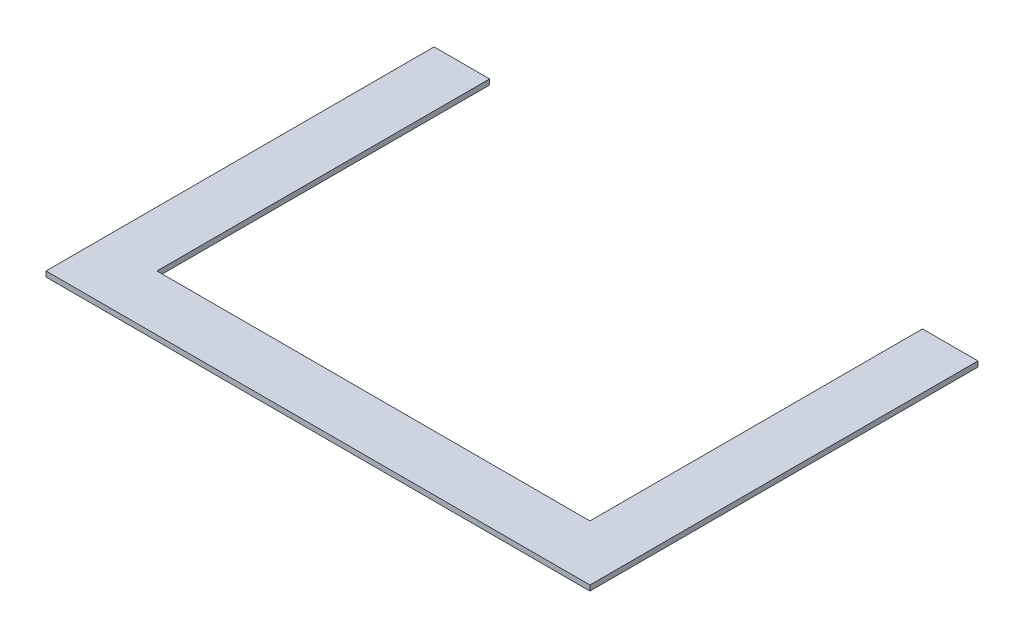
ISO-10303-21;
HEADER;
FILE_DESCRIPTION(('STEP AP214'),'2;1');
FILE_NAME('part.step','',(''),(''),'','','');
FILE_SCHEMA(('AUTOMOTIVE_DESIGN { 1 0 10303 214 1 1 1 1 }'));
ENDSEC;
DATA;
#1=APPLICATION_CONTEXT('core data for automotive mechanical design processes');
#2=APPLICATION_PROTOCOL_DEFINITION('international standard','automotive_design',2000,#1);
#3=PRODUCT_CONTEXT('',#1,'mechanical');
#4=PRODUCT('Part','Part','',(#3));
#5=PRODUCT_RELATED_PRODUCT_CATEGORY('part','',(#4));
#6=PRODUCT_DEFINITION_FORMATION('','',#4);
#7=PRODUCT_DEFINITION_CONTEXT('part definition',#1,'design');
#8=PRODUCT_DEFINITION('design','',#6,#7);
#9=PRODUCT_DEFINITION_SHAPE('','',#8);
#10=(LENGTH_UNIT() NAMED_UNIT(*) SI_UNIT(.MILLI.,.METRE.));
#11=(NAMED_UNIT(*) PLANE_ANGLE_UNIT() SI_UNIT($,.RADIAN.));
#12=(NAMED_UNIT(*) SI_UNIT($,.STERADIAN.) SOLID_ANGLE_UNIT());
#13=UNCERTAINTY_MEASURE_WITH_UNIT(LENGTH_MEASURE(1.E-05),#10,'distance_accuracy_value','');
#14=(GEOMETRIC_REPRESENTATION_CONTEXT(3) GLOBAL_UNCERTAINTY_ASSIGNED_CONTEXT((#13)) GLOBAL_UNIT_ASSIGNED_CONTEXT((#10,
#11,#12)) REPRESENTATION_CONTEXT('',''));
#15=CARTESIAN_POINT('',(0.,0.,0.));
#16=DIRECTION('',(0.,0.,1.));
#17=DIRECTION('',(1.,0.,0.));
#18=AXIS2_PLACEMENT_3D('',#15,#16,#17);
#19=CARTESIAN_POINT('',(-40.500924590164,1.8288,97.1796713114754));
#20=DIRECTION('',(1.,0.,0.));
#21=DIRECTION('',(0.,0.,-1.));
#22=AXIS2_PLACEMENT_3D('',#19,#20,#21);
#23=PLANE('',#22);
#24=DIRECTION('',(0.,0.,1.));
#25=VECTOR('',#24,1.);
#26=CARTESIAN_POINT('',(-40.500924590164,0.,97.1796713114754));
#27=LINE('',#26,#25);
#28=CARTESIAN_POINT('',(-40.500924590164,0.,-36.7672286885246));
#29=VERTEX_POINT('',#28);
#30=CARTESIAN_POINT('',(-40.500924590164,0.,97.1796713114754));
#31=VERTEX_POINT('',#30);
#32=EDGE_CURVE('E128',#29,#31,#27,.T.);
#33=ORIENTED_EDGE('',*,*,#32,.T.);
#34=DIRECTION('',(0.,-1.,0.));
#35=VECTOR('',#34,1.);
#36=CARTESIAN_POINT('',(-40.500924590164,1.8288,97.1796713114754));
#37=LINE('',#36,#35);
#38=CARTESIAN_POINT('',(-40.500924590164,1.8288,97.1796713114754));
#39=VERTEX_POINT('',#38);
#40=EDGE_CURVE('E11',#39,#31,#37,.T.);
#41=ORIENTED_EDGE('',*,*,#40,.F.);
#42=DIRECTION('',(0.,0.,1.));
#43=VECTOR('',#42,1.);
#44=CARTESIAN_POINT('',(-40.500924590164,1.8288,97.1796713114754));
#45=LINE('',#44,#43);
#46=CARTESIAN_POINT('',(-40.500924590164,1.8288,-36.7672286885246));
#47=VERTEX_POINT('',#46);
#48=EDGE_CURVE('E142',#47,#39,#45,.T.);
#49=ORIENTED_EDGE('',*,*,#48,.F.);
#50=DIRECTION('',(0.,-1.,0.));
#51=VECTOR('',#50,1.);
#52=CARTESIAN_POINT('',(-40.500924590164,1.8288,-36.7672286885246));
#53=LINE('',#52,#51);
#54=EDGE_CURVE('E124',#47,#29,#53,.T.);
#55=ORIENTED_EDGE('',*,*,#54,.T.);
#56=EDGE_LOOP('',(#33,#41,#49,#55));
#57=FACE_BOUND('',#56,.T.);
#58=ADVANCED_FACE('F32',(#57),#23,.F.);
#59=CARTESIAN_POINT('',(147.230475409836,1.8288,97.1796713114754));
#60=DIRECTION('',(0.,0.,-1.));
#61=DIRECTION('',(-1.,0.,0.));
#62=AXIS2_PLACEMENT_3D('',#59,#60,#61);
#63=PLANE('',#62);
#64=DIRECTION('',(1.,0.,0.));
#65=VECTOR('',#64,1.);
#66=CARTESIAN_POINT('',(147.230475409836,0.,97.1796713114754));
#67=LINE('',#66,#65);
#68=CARTESIAN_POINT('',(147.230475409836,0.,97.1796713114754));
#69=VERTEX_POINT('',#68);
#70=EDGE_CURVE('E131',#31,#69,#67,.T.);
#71=ORIENTED_EDGE('',*,*,#70,.T.);
#72=DIRECTION('',(0.,-1.,0.));
#73=VECTOR('',#72,1.);
#74=CARTESIAN_POINT('',(147.230475409836,1.8288,97.1796713114754));
#75=LINE('',#74,#73);
#76=CARTESIAN_POINT('',(147.230475409836,1.8288,97.1796713114754));
#77=VERTEX_POINT('',#76);
#78=EDGE_CURVE('E40',#77,#69,#75,.T.);
#79=ORIENTED_EDGE('',*,*,#78,.F.);
#80=DIRECTION('',(1.,0.,0.));
#81=VECTOR('',#80,1.);
#82=CARTESIAN_POINT('',(147.230475409836,1.8288,97.1796713114754));
#83=LINE('',#82,#81);
#84=EDGE_CURVE('E91',#39,#77,#83,.T.);
#85=ORIENTED_EDGE('',*,*,#84,.F.);
#86=ORIENTED_EDGE('',*,*,#40,.T.);
#87=EDGE_LOOP('',(#71,#79,#85,#86));
#88=FACE_BOUND('',#87,.T.);
#89=ADVANCED_FACE('F177',(#88),#63,.F.);
#90=CARTESIAN_POINT('',(147.230475409836,1.8288,-36.7672286885246));
#91=DIRECTION('',(-1.,0.,0.));
#92=DIRECTION('',(0.,0.,1.));
#93=AXIS2_PLACEMENT_3D('',#90,#91,#92);
#94=PLANE('',#93);
#95=DIRECTION('',(0.,0.,-1.));
#96=VECTOR('',#95,1.);
#97=CARTESIAN_POINT('',(147.230475409836,0.,-36.7672286885246));
#98=LINE('',#97,#96);
#99=CARTESIAN_POINT('',(147.230475409836,0.,-36.7672286885246));
#100=VERTEX_POINT('',#99);
#101=EDGE_CURVE('E133',#69,#100,#98,.T.);
#102=ORIENTED_EDGE('',*,*,#101,.T.);
#103=DIRECTION('',(0.,-1.,0.));
#104=VECTOR('',#103,1.);
#105=CARTESIAN_POINT('',(147.230475409836,1.8288,-36.7672286885246));
#106=LINE('',#105,#104);
#107=CARTESIAN_POINT('',(147.230475409836,1.8288,-36.7672286885246));
#108=VERTEX_POINT('',#107);
#109=EDGE_CURVE('E149',#108,#100,#106,.T.);
#110=ORIENTED_EDGE('',*,*,#109,.F.);
#111=DIRECTION('',(0.,0.,-1.));
#112=VECTOR('',#111,1.);
#113=CARTESIAN_POINT('',(147.230475409836,1.8288,-36.7672286885246));
#114=LINE('',#113,#112);
#115=EDGE_CURVE('E157',#77,#108,#114,.T.);
#116=ORIENTED_EDGE('',*,*,#115,.F.);
#117=ORIENTED_EDGE('',*,*,#78,.T.);
#118=EDGE_LOOP('',(#102,#110,#116,#117));
#119=FACE_BOUND('',#118,.T.);
#120=ADVANCED_FACE('F155',(#119),#94,.F.);
#121=CARTESIAN_POINT('',(128.078875409836,1.8288,-36.7672286885246));
#122=DIRECTION('',(0.,0.,1.));
#123=DIRECTION('',(1.,0.,0.));
#124=AXIS2_PLACEMENT_3D('',#121,#122,#123);
#125=PLANE('',#124);
#126=DIRECTION('',(-1.,0.,0.));
#127=VECTOR('',#126,1.);
#128=CARTESIAN_POINT('',(128.078875409836,0.,-36.7672286885246));
#129=LINE('',#128,#127);
#130=CARTESIAN_POINT('',(128.078875409836,0.,-36.7672286885246));
#131=VERTEX_POINT('',#130);
#132=EDGE_CURVE('E135',#100,#131,#129,.T.);
#133=ORIENTED_EDGE('',*,*,#132,.T.);
#134=DIRECTION('',(0.,-1.,0.));
#135=VECTOR('',#134,1.);
#136=CARTESIAN_POINT('',(128.078875409836,1.8288,-36.7672286885246));
#137=LINE('',#136,#135);
#138=CARTESIAN_POINT('',(128.078875409836,1.8288,-36.7672286885246));
#139=VERTEX_POINT('',#138);
#140=EDGE_CURVE('E146',#139,#131,#137,.T.);
#141=ORIENTED_EDGE('',*,*,#140,.F.);
#142=DIRECTION('',(-1.,0.,0.));
#143=VECTOR('',#142,1.);
#144=CARTESIAN_POINT('',(128.078875409836,1.8288,-36.7672286885246));
#145=LINE('',#144,#143);
#146=EDGE_CURVE('E169',#108,#139,#145,.T.);
#147=ORIENTED_EDGE('',*,*,#146,.F.);
#148=ORIENTED_EDGE('',*,*,#109,.T.);
#149=EDGE_LOOP('',(#133,#141,#147,#148));
#150=FACE_BOUND('',#149,.T.);
#151=ADVANCED_FACE('F165',(#150),#125,.F.);
#152=CARTESIAN_POINT('',(128.078875409836,1.8288,78.0280713114754));
#153=DIRECTION('',(1.,0.,0.));
#154=DIRECTION('',(0.,0.,-1.));
#155=AXIS2_PLACEMENT_3D('',#152,#153,#154);
#156=PLANE('',#155);
#157=DIRECTION('',(0.,0.,1.));
#158=VECTOR('',#157,1.);
#159=CARTESIAN_POINT('',(128.078875409836,0.,78.0280713114754));
#160=LINE('',#159,#158);
#161=CARTESIAN_POINT('',(128.078875409836,0.,78.0280713114754));
#162=VERTEX_POINT('',#161);
#163=EDGE_CURVE('E137',#131,#162,#160,.T.);
#164=ORIENTED_EDGE('',*,*,#163,.T.);
#165=DIRECTION('',(0.,-1.,0.));
#166=VECTOR('',#165,1.);
#167=CARTESIAN_POINT('',(128.078875409836,1.8288,78.0280713114754));
#168=LINE('',#167,#166);
#169=CARTESIAN_POINT('',(128.078875409836,1.8288,78.0280713114754));
#170=VERTEX_POINT('',#169);
#171=EDGE_CURVE('E119',#170,#162,#168,.T.);
#172=ORIENTED_EDGE('',*,*,#171,.F.);
#173=DIRECTION('',(0.,0.,1.));
#174=VECTOR('',#173,1.);
#175=CARTESIAN_POINT('',(128.078875409836,1.8288,78.0280713114754));
#176=LINE('',#175,#174);
#177=EDGE_CURVE('E110',#139,#170,#176,.T.);
#178=ORIENTED_EDGE('',*,*,#177,.F.);
#179=ORIENTED_EDGE('',*,*,#140,.T.);
#180=EDGE_LOOP('',(#164,#172,#178,#179));
#181=FACE_BOUND('',#180,.T.);
#182=ADVANCED_FACE('F168',(#181),#156,.F.);
#183=CARTESIAN_POINT('',(-21.3493245901639,1.8288,78.0280713114754));
#184=DIRECTION('',(0.,0.,1.));
#185=DIRECTION('',(1.,0.,0.));
#186=AXIS2_PLACEMENT_3D('',#183,#184,#185);
#187=PLANE('',#186);
#188=DIRECTION('',(-1.,0.,0.));
#189=VECTOR('',#188,1.);
#190=CARTESIAN_POINT('',(-21.3493245901639,0.,78.0280713114754));
#191=LINE('',#190,#189);
#192=CARTESIAN_POINT('',(-21.3493245901639,0.,78.0280713114754));
#193=VERTEX_POINT('',#192);
#194=EDGE_CURVE('E118',#162,#193,#191,.T.);
#195=ORIENTED_EDGE('',*,*,#194,.T.);
#196=DIRECTION('',(0.,-1.,0.));
#197=VECTOR('',#196,1.);
#198=CARTESIAN_POINT('',(-21.3493245901639,1.8288,78.0280713114754));
#199=LINE('',#198,#197);
#200=CARTESIAN_POINT('',(-21.3493245901639,1.8288,78.0280713114754));
#201=VERTEX_POINT('',#200);
#202=EDGE_CURVE('E115',#201,#193,#199,.T.);
#203=ORIENTED_EDGE('',*,*,#202,.F.);
#204=DIRECTION('',(-1.,0.,0.));
#205=VECTOR('',#204,1.);
#206=CARTESIAN_POINT('',(-21.3493245901639,1.8288,78.0280713114754));
#207=LINE('',#206,#205);
#208=EDGE_CURVE('E104',#170,#201,#207,.T.);
#209=ORIENTED_EDGE('',*,*,#208,.F.);
#210=ORIENTED_EDGE('',*,*,#171,.T.);
#211=EDGE_LOOP('',(#195,#203,#209,#210));
#212=FACE_BOUND('',#211,.T.);
#213=ADVANCED_FACE('F116',(#212),#187,.F.);
#214=CARTESIAN_POINT('',(-21.349324590164,1.8288,-36.7672286885246));
#215=DIRECTION('',(-1.,0.,0.));
#216=DIRECTION('',(0.,0.,1.));
#217=AXIS2_PLACEMENT_3D('',#214,#215,#216);
#218=PLANE('',#217);
#219=DIRECTION('',(0.,0.,-1.));
#220=VECTOR('',#219,1.);
#221=CARTESIAN_POINT('',(-21.349324590164,0.,-36.7672286885246));
#222=LINE('',#221,#220);
#223=CARTESIAN_POINT('',(-21.349324590164,0.,-36.7672286885246));
#224=VERTEX_POINT('',#223);
#225=EDGE_CURVE('E77',#193,#224,#222,.T.);
#226=ORIENTED_EDGE('',*,*,#225,.T.);
#227=DIRECTION('',(0.,-1.,0.));
#228=VECTOR('',#227,1.);
#229=CARTESIAN_POINT('',(-21.349324590164,1.8288,-36.7672286885246));
#230=LINE('',#229,#228);
#231=CARTESIAN_POINT('',(-21.349324590164,1.8288,-36.7672286885246));
#232=VERTEX_POINT('',#231);
#233=EDGE_CURVE('E120',#232,#224,#230,.T.);
#234=ORIENTED_EDGE('',*,*,#233,.F.);
#235=DIRECTION('',(0.,0.,-1.));
#236=VECTOR('',#235,1.);
#237=CARTESIAN_POINT('',(-21.349324590164,1.8288,-36.7672286885246));
#238=LINE('',#237,#236);
#239=EDGE_CURVE('E108',#201,#232,#238,.T.);
#240=ORIENTED_EDGE('',*,*,#239,.F.);
#241=ORIENTED_EDGE('',*,*,#202,.T.);
#242=EDGE_LOOP('',(#226,#234,#240,#241));
#243=FACE_BOUND('',#242,.T.);
#244=ADVANCED_FACE('F122',(#243),#218,.F.);
#245=CARTESIAN_POINT('',(-40.500924590164,1.8288,-36.7672286885246));
#246=DIRECTION('',(0.,0.,1.));
#247=DIRECTION('',(1.,0.,0.));
#248=AXIS2_PLACEMENT_3D('',#245,#246,#247);
#249=PLANE('',#248);
#250=DIRECTION('',(-1.,0.,0.));
#251=VECTOR('',#250,1.);
#252=CARTESIAN_POINT('',(-40.500924590164,0.,-36.7672286885246));
#253=LINE('',#252,#251);
#254=EDGE_CURVE('E83',#224,#29,#253,.T.);
#255=ORIENTED_EDGE('',*,*,#254,.T.);
#256=ORIENTED_EDGE('',*,*,#54,.F.);
#257=DIRECTION('',(-1.,0.,0.));
#258=VECTOR('',#257,1.);
#259=CARTESIAN_POINT('',(-40.500924590164,1.8288,-36.7672286885246));
#260=LINE('',#259,#258);
#261=EDGE_CURVE('E48',#232,#47,#260,.T.);
#262=ORIENTED_EDGE('',*,*,#261,.F.);
#263=ORIENTED_EDGE('',*,*,#233,.T.);
#264=EDGE_LOOP('',(#255,#256,#262,#263));
#265=FACE_BOUND('',#264,.T.);
#266=ADVANCED_FACE('F193',(#265),#249,.F.);
#267=CARTESIAN_POINT('',(0.,1.8288,0.));
#268=DIRECTION('',(0.,-1.,0.));
#269=DIRECTION('',(0.,0.,-1.));
#270=AXIS2_PLACEMENT_3D('',#267,#268,#269);
#271=PLANE('',#270);
#272=ORIENTED_EDGE('',*,*,#48,.T.);
#273=ORIENTED_EDGE('',*,*,#84,.T.);
#274=ORIENTED_EDGE('',*,*,#115,.T.);
#275=ORIENTED_EDGE('',*,*,#146,.T.);
#276=ORIENTED_EDGE('',*,*,#177,.T.);
#277=ORIENTED_EDGE('',*,*,#208,.T.);
#278=ORIENTED_EDGE('',*,*,#239,.T.);
#279=ORIENTED_EDGE('',*,*,#261,.T.);
#280=EDGE_LOOP('',(#272,#273,#274,#275,#276,#277,#278,#279));
#281=FACE_BOUND('',#280,.T.);
#282=ADVANCED_FACE('F106',(#281),#271,.F.);
#283=CARTESIAN_POINT('',(0.,0.,0.));
#284=DIRECTION('',(0.,-1.,0.));
#285=DIRECTION('',(0.,0.,-1.));
#286=AXIS2_PLACEMENT_3D('',#283,#284,#285);
#287=PLANE('',#286);
#288=ORIENTED_EDGE('',*,*,#32,.F.);
#289=ORIENTED_EDGE('',*,*,#254,.F.);
#290=ORIENTED_EDGE('',*,*,#225,.F.);
#291=ORIENTED_EDGE('',*,*,#194,.F.);
#292=ORIENTED_EDGE('',*,*,#163,.F.);
#293=ORIENTED_EDGE('',*,*,#132,.F.);
#294=ORIENTED_EDGE('',*,*,#101,.F.);
#295=ORIENTED_EDGE('',*,*,#70,.F.);
#296=EDGE_LOOP('',(#288,#289,#290,#291,#292,#293,#294,#295));
#297=FACE_BOUND('',#296,.T.);
#298=ADVANCED_FACE('F161',(#297),#287,.T.);
#299=CLOSED_SHELL('',(#58,#89,#120,#151,#182,#213,#244,#266,#282,#298));
#300=MANIFOLD_SOLID_BREP('B2',#299);
#301=ADVANCED_BREP_SHAPE_REPRESENTATION('',(#18,#300),#14);
#302=SHAPE_DEFINITION_REPRESENTATION(#9,#301);
ENDSEC;
END-ISO-10303-21;
